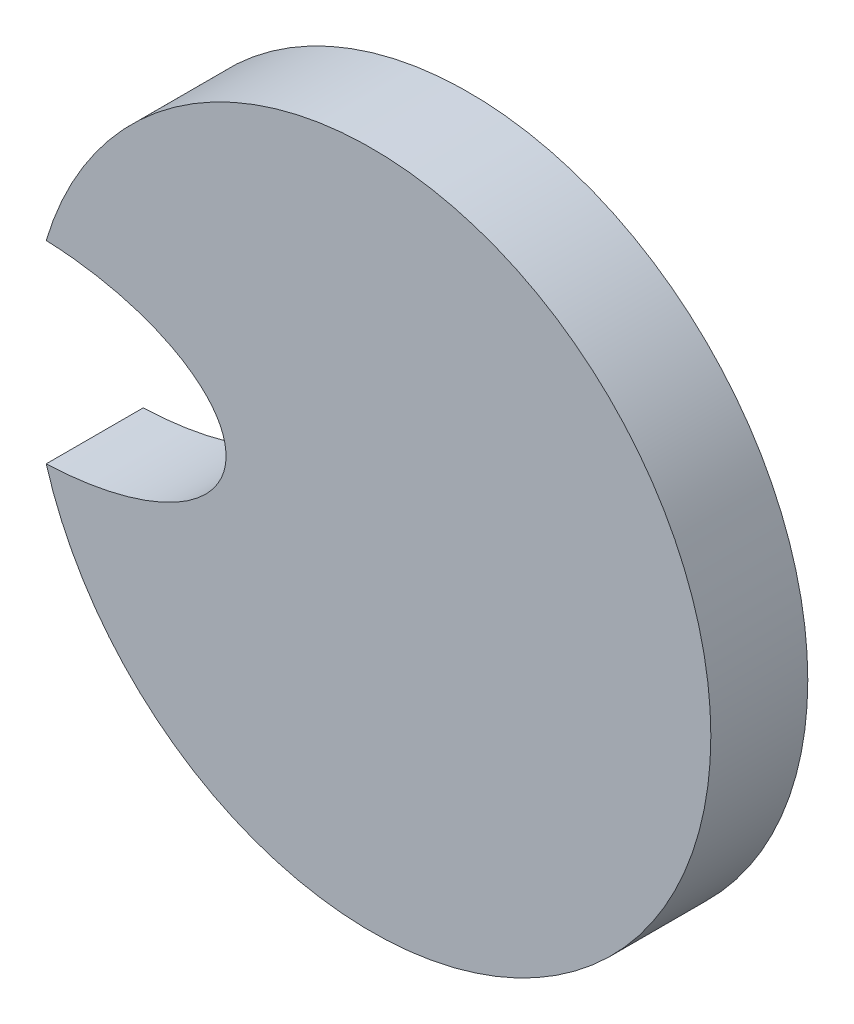
ISO-10303-21;
HEADER;
FILE_DESCRIPTION(('STEP AP214'),'2;1');
FILE_NAME('part.step','',(''),(''),'','','');
FILE_SCHEMA(('AUTOMOTIVE_DESIGN { 1 0 10303 214 1 1 1 1 }'));
ENDSEC;
DATA;
#1=APPLICATION_CONTEXT('core data for automotive mechanical design processes');
#2=APPLICATION_PROTOCOL_DEFINITION('international standard','automotive_design',2000,#1);
#3=PRODUCT_CONTEXT('',#1,'mechanical');
#4=PRODUCT('Part','Part','',(#3));
#5=PRODUCT_RELATED_PRODUCT_CATEGORY('part','',(#4));
#6=PRODUCT_DEFINITION_FORMATION('','',#4);
#7=PRODUCT_DEFINITION_CONTEXT('part definition',#1,'design');
#8=PRODUCT_DEFINITION('design','',#6,#7);
#9=PRODUCT_DEFINITION_SHAPE('','',#8);
#10=(LENGTH_UNIT() NAMED_UNIT(*) SI_UNIT(.MILLI.,.METRE.));
#11=(NAMED_UNIT(*) PLANE_ANGLE_UNIT() SI_UNIT($,.RADIAN.));
#12=(NAMED_UNIT(*) SI_UNIT($,.STERADIAN.) SOLID_ANGLE_UNIT());
#13=UNCERTAINTY_MEASURE_WITH_UNIT(LENGTH_MEASURE(1.E-05),#10,'distance_accuracy_value','');
#14=(GEOMETRIC_REPRESENTATION_CONTEXT(3) GLOBAL_UNCERTAINTY_ASSIGNED_CONTEXT((#13)) GLOBAL_UNIT_ASSIGNED_CONTEXT((#10,
#11,#12)) REPRESENTATION_CONTEXT('',''));
#15=CARTESIAN_POINT('',(0.,0.,0.));
#16=DIRECTION('',(0.,0.,1.));
#17=DIRECTION('',(1.,0.,0.));
#18=AXIS2_PLACEMENT_3D('',#15,#16,#17);
#19=CARTESIAN_POINT('',(0.,0.,10.));
#20=DIRECTION('',(0.,0.,-1.));
#21=DIRECTION('',(-1.,0.,0.));
#22=AXIS2_PLACEMENT_3D('',#19,#20,#21);
#23=CYLINDRICAL_SURFACE('',#22,35.);
#24=CARTESIAN_POINT('',(0.,0.,0.));
#25=DIRECTION('',(0.,0.,1.));
#26=DIRECTION('',(1.,0.,0.));
#27=AXIS2_PLACEMENT_3D('',#24,#25,#26);
#28=CIRCLE('',#27,35.);
#29=CARTESIAN_POINT('',(-33.5488665541685,-9.97364291172475,0.));
#30=VERTEX_POINT('',#29);
#31=CARTESIAN_POINT('',(-33.5488665541685,9.97364291172475,0.));
#32=VERTEX_POINT('',#31);
#33=EDGE_CURVE('E73',#30,#32,#28,.T.);
#34=ORIENTED_EDGE('',*,*,#33,.T.);
#35=DIRECTION('',(0.,0.,1.));
#36=VECTOR('',#35,1.);
#37=CARTESIAN_POINT('',(-33.5488665541685,9.97364291172475,-10.));
#38=LINE('',#37,#36);
#39=CARTESIAN_POINT('',(-33.5488665541685,9.97364291172475,10.));
#40=VERTEX_POINT('',#39);
#41=EDGE_CURVE('E53',#32,#40,#38,.T.);
#42=ORIENTED_EDGE('',*,*,#41,.T.);
#43=CARTESIAN_POINT('',(0.,0.,10.));
#44=DIRECTION('',(0.,0.,1.));
#45=DIRECTION('',(1.,0.,0.));
#46=AXIS2_PLACEMENT_3D('',#43,#44,#45);
#47=CIRCLE('',#46,35.);
#48=CARTESIAN_POINT('',(-33.5488665541685,-9.97364291172475,10.));
#49=VERTEX_POINT('',#48);
#50=EDGE_CURVE('E46',#49,#40,#47,.T.);
#51=ORIENTED_EDGE('',*,*,#50,.F.);
#52=DIRECTION('',(0.,0.,1.));
#53=VECTOR('',#52,1.);
#54=CARTESIAN_POINT('',(-33.5488665541685,-9.97364291172475,-10.));
#55=LINE('',#54,#53);
#56=EDGE_CURVE('E60',#49,#30,#55,.F.);
#57=ORIENTED_EDGE('',*,*,#56,.T.);
#58=EDGE_LOOP('',(#34,#42,#51,#57));
#59=FACE_BOUND('',#58,.T.);
#60=ADVANCED_FACE('F39',(#59),#23,.T.);
#61=CARTESIAN_POINT('',(0.,0.,10.));
#62=DIRECTION('',(0.,0.,1.));
#63=DIRECTION('',(1.,0.,0.));
#64=AXIS2_PLACEMENT_3D('',#61,#62,#63);
#65=PLANE('',#64);
#66=CARTESIAN_POINT('',(-35.,0.,10.));
#67=DIRECTION('',(0.,0.,1.));
#68=DIRECTION('',(-1.,0.,0.));
#69=AXIS2_PLACEMENT_3D('',#66,#67,#68);
#70=ELLIPSE('',#69,20.,10.);
#71=EDGE_CURVE('E63',#49,#40,#70,.T.);
#72=ORIENTED_EDGE('',*,*,#71,.F.);
#73=ORIENTED_EDGE('',*,*,#50,.T.);
#74=EDGE_LOOP('',(#72,#73));
#75=FACE_BOUND('',#74,.T.);
#76=ADVANCED_FACE('F71',(#75),#65,.T.);
#77=CARTESIAN_POINT('',(0.,0.,0.));
#78=DIRECTION('',(0.,0.,1.));
#79=DIRECTION('',(1.,0.,0.));
#80=AXIS2_PLACEMENT_3D('',#77,#78,#79);
#81=PLANE('',#80);
#82=ORIENTED_EDGE('',*,*,#33,.F.);
#83=CARTESIAN_POINT('',(-35.,0.,0.));
#84=DIRECTION('',(0.,0.,1.));
#85=DIRECTION('',(-1.,0.,0.));
#86=AXIS2_PLACEMENT_3D('',#83,#84,#85);
#87=ELLIPSE('',#86,20.,10.);
#88=EDGE_CURVE('E11',#30,#32,#87,.T.);
#89=ORIENTED_EDGE('',*,*,#88,.T.);
#90=EDGE_LOOP('',(#82,#89));
#91=FACE_BOUND('',#90,.T.);
#92=ADVANCED_FACE('F81',(#91),#81,.F.);
#93=CARTESIAN_POINT('',(-35.,0.,-10.));
#94=DIRECTION('',(0.,0.,1.));
#95=DIRECTION('',(-1.,0.,0.));
#96=AXIS2_PLACEMENT_3D('',#93,#94,#95);
#97=ELLIPSE('',#96,20.,10.);
#98=DIRECTION('',(0.,0.,1.));
#99=VECTOR('',#98,1.);
#100=SURFACE_OF_LINEAR_EXTRUSION('',#97,#99);
#101=ORIENTED_EDGE('',*,*,#88,.F.);
#102=ORIENTED_EDGE('',*,*,#56,.F.);
#103=ORIENTED_EDGE('',*,*,#71,.T.);
#104=ORIENTED_EDGE('',*,*,#41,.F.);
#105=EDGE_LOOP('',(#101,#102,#103,#104));
#106=FACE_BOUND('',#105,.T.);
#107=ADVANCED_FACE('F62',(#106),#100,.F.);
#108=CLOSED_SHELL('',(#60,#76,#92,#107));
#109=MANIFOLD_SOLID_BREP('B2',#108);
#110=ADVANCED_BREP_SHAPE_REPRESENTATION('',(#18,#109),#14);
#111=SHAPE_DEFINITION_REPRESENTATION(#9,#110);
ENDSEC;
END-ISO-10303-21;
